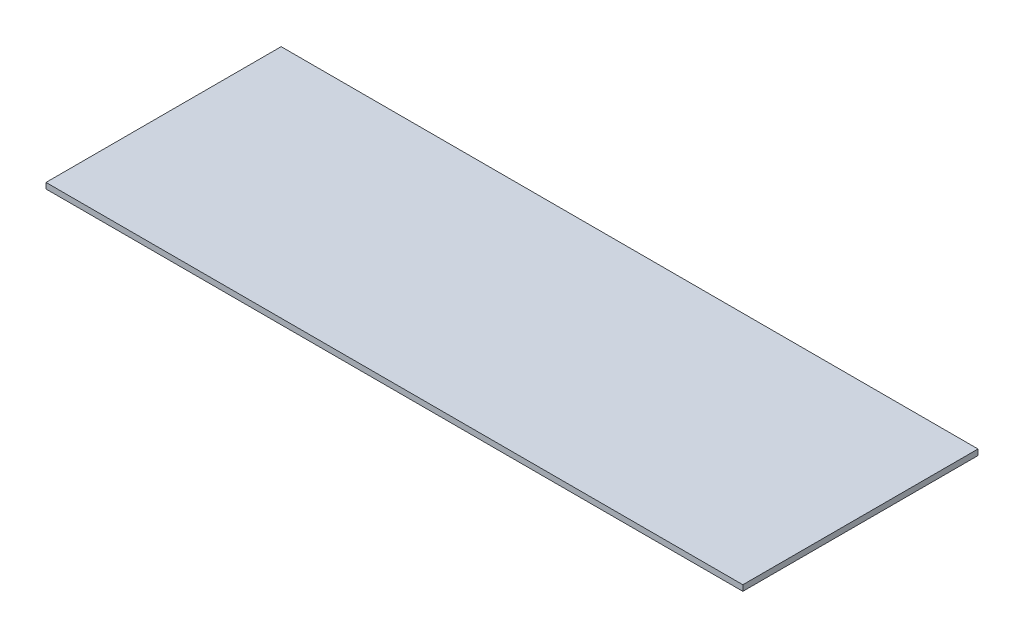
ISO-10303-21;
HEADER;
FILE_DESCRIPTION(('STEP AP214'),'2;1');
FILE_NAME('part.step','',(''),(''),'','','');
FILE_SCHEMA(('AUTOMOTIVE_DESIGN { 1 0 10303 214 1 1 1 1 }'));
ENDSEC;
DATA;
#1=APPLICATION_CONTEXT('core data for automotive mechanical design processes');
#2=APPLICATION_PROTOCOL_DEFINITION('international standard','automotive_design',2000,#1);
#3=PRODUCT_CONTEXT('',#1,'mechanical');
#4=PRODUCT('Part','Part','',(#3));
#5=PRODUCT_RELATED_PRODUCT_CATEGORY('part','',(#4));
#6=PRODUCT_DEFINITION_FORMATION('','',#4);
#7=PRODUCT_DEFINITION_CONTEXT('part definition',#1,'design');
#8=PRODUCT_DEFINITION('design','',#6,#7);
#9=PRODUCT_DEFINITION_SHAPE('','',#8);
#10=(LENGTH_UNIT() NAMED_UNIT(*) SI_UNIT(.MILLI.,.METRE.));
#11=(NAMED_UNIT(*) PLANE_ANGLE_UNIT() SI_UNIT($,.RADIAN.));
#12=(NAMED_UNIT(*) SI_UNIT($,.STERADIAN.) SOLID_ANGLE_UNIT());
#13=UNCERTAINTY_MEASURE_WITH_UNIT(LENGTH_MEASURE(1.E-05),#10,'distance_accuracy_value','');
#14=(GEOMETRIC_REPRESENTATION_CONTEXT(3) GLOBAL_UNCERTAINTY_ASSIGNED_CONTEXT((#13)) GLOBAL_UNIT_ASSIGNED_CONTEXT((#10,
#11,#12)) REPRESENTATION_CONTEXT('',''));
#15=CARTESIAN_POINT('',(0.,0.,0.));
#16=DIRECTION('',(0.,0.,1.));
#17=DIRECTION('',(1.,0.,0.));
#18=AXIS2_PLACEMENT_3D('',#15,#16,#17);
#19=CARTESIAN_POINT('',(3037.5,50.,1025.));
#20=DIRECTION('',(-1.,0.,0.));
#21=DIRECTION('',(0.,0.,1.));
#22=AXIS2_PLACEMENT_3D('',#19,#20,#21);
#23=PLANE('',#22);
#24=DIRECTION('',(0.,0.,-1.));
#25=VECTOR('',#24,1.);
#26=CARTESIAN_POINT('',(3037.5,0.,1025.));
#27=LINE('',#26,#25);
#28=CARTESIAN_POINT('',(3037.5,0.,1025.));
#29=VERTEX_POINT('',#28);
#30=CARTESIAN_POINT('',(3037.5,0.,-1025.));
#31=VERTEX_POINT('',#30);
#32=EDGE_CURVE('E102',#29,#31,#27,.T.);
#33=ORIENTED_EDGE('',*,*,#32,.T.);
#34=DIRECTION('',(0.,-1.,0.));
#35=VECTOR('',#34,1.);
#36=CARTESIAN_POINT('',(3037.5,50.,-1025.));
#37=LINE('',#36,#35);
#38=CARTESIAN_POINT('',(3037.5,50.,-1025.));
#39=VERTEX_POINT('',#38);
#40=EDGE_CURVE('E11',#39,#31,#37,.T.);
#41=ORIENTED_EDGE('',*,*,#40,.F.);
#42=DIRECTION('',(0.,0.,-1.));
#43=VECTOR('',#42,1.);
#44=CARTESIAN_POINT('',(3037.5,50.,1025.));
#45=LINE('',#44,#43);
#46=CARTESIAN_POINT('',(3037.5,50.,1025.));
#47=VERTEX_POINT('',#46);
#48=EDGE_CURVE('E95',#47,#39,#45,.T.);
#49=ORIENTED_EDGE('',*,*,#48,.F.);
#50=DIRECTION('',(0.,-1.,0.));
#51=VECTOR('',#50,1.);
#52=CARTESIAN_POINT('',(3037.5,50.,1025.));
#53=LINE('',#52,#51);
#54=EDGE_CURVE('E99',#47,#29,#53,.T.);
#55=ORIENTED_EDGE('',*,*,#54,.T.);
#56=EDGE_LOOP('',(#33,#41,#49,#55));
#57=FACE_BOUND('',#56,.T.);
#58=ADVANCED_FACE('F41',(#57),#23,.F.);
#59=CARTESIAN_POINT('',(-3037.5,50.,-1025.));
#60=DIRECTION('',(0.,0.,1.));
#61=DIRECTION('',(1.,0.,0.));
#62=AXIS2_PLACEMENT_3D('',#59,#60,#61);
#63=PLANE('',#62);
#64=DIRECTION('',(-1.,0.,0.));
#65=VECTOR('',#64,1.);
#66=CARTESIAN_POINT('',(-3037.5,0.,-1025.));
#67=LINE('',#66,#65);
#68=CARTESIAN_POINT('',(-3037.5,0.,-1025.));
#69=VERTEX_POINT('',#68);
#70=EDGE_CURVE('E96',#31,#69,#67,.T.);
#71=ORIENTED_EDGE('',*,*,#70,.T.);
#72=DIRECTION('',(0.,-1.,0.));
#73=VECTOR('',#72,1.);
#74=CARTESIAN_POINT('',(-3037.5,50.,-1025.));
#75=LINE('',#74,#73);
#76=CARTESIAN_POINT('',(-3037.5,50.,-1025.));
#77=VERTEX_POINT('',#76);
#78=EDGE_CURVE('E47',#77,#69,#75,.T.);
#79=ORIENTED_EDGE('',*,*,#78,.F.);
#80=DIRECTION('',(-1.,0.,0.));
#81=VECTOR('',#80,1.);
#82=CARTESIAN_POINT('',(-3037.5,50.,-1025.));
#83=LINE('',#82,#81);
#84=EDGE_CURVE('E87',#39,#77,#83,.T.);
#85=ORIENTED_EDGE('',*,*,#84,.F.);
#86=ORIENTED_EDGE('',*,*,#40,.T.);
#87=EDGE_LOOP('',(#71,#79,#85,#86));
#88=FACE_BOUND('',#87,.T.);
#89=ADVANCED_FACE('F92',(#88),#63,.F.);
#90=CARTESIAN_POINT('',(-3037.5,50.,1025.));
#91=DIRECTION('',(1.,0.,0.));
#92=DIRECTION('',(0.,0.,-1.));
#93=AXIS2_PLACEMENT_3D('',#90,#91,#92);
#94=PLANE('',#93);
#95=DIRECTION('',(0.,0.,1.));
#96=VECTOR('',#95,1.);
#97=CARTESIAN_POINT('',(-3037.5,0.,1025.));
#98=LINE('',#97,#96);
#99=CARTESIAN_POINT('',(-3037.5,0.,1025.));
#100=VERTEX_POINT('',#99);
#101=EDGE_CURVE('E74',#69,#100,#98,.T.);
#102=ORIENTED_EDGE('',*,*,#101,.T.);
#103=DIRECTION('',(0.,-1.,0.));
#104=VECTOR('',#103,1.);
#105=CARTESIAN_POINT('',(-3037.5,50.,1025.));
#106=LINE('',#105,#104);
#107=CARTESIAN_POINT('',(-3037.5,50.,1025.));
#108=VERTEX_POINT('',#107);
#109=EDGE_CURVE('E100',#108,#100,#106,.T.);
#110=ORIENTED_EDGE('',*,*,#109,.F.);
#111=DIRECTION('',(0.,0.,1.));
#112=VECTOR('',#111,1.);
#113=CARTESIAN_POINT('',(-3037.5,50.,1025.));
#114=LINE('',#113,#112);
#115=EDGE_CURVE('E89',#77,#108,#114,.T.);
#116=ORIENTED_EDGE('',*,*,#115,.F.);
#117=ORIENTED_EDGE('',*,*,#78,.T.);
#118=EDGE_LOOP('',(#102,#110,#116,#117));
#119=FACE_BOUND('',#118,.T.);
#120=ADVANCED_FACE('F98',(#119),#94,.F.);
#121=CARTESIAN_POINT('',(-3037.5,50.,1025.));
#122=DIRECTION('',(0.,0.,-1.));
#123=DIRECTION('',(-1.,0.,0.));
#124=AXIS2_PLACEMENT_3D('',#121,#122,#123);
#125=PLANE('',#124);
#126=DIRECTION('',(1.,0.,0.));
#127=VECTOR('',#126,1.);
#128=CARTESIAN_POINT('',(-3037.5,0.,1025.));
#129=LINE('',#128,#127);
#130=EDGE_CURVE('E76',#100,#29,#129,.T.);
#131=ORIENTED_EDGE('',*,*,#130,.T.);
#132=ORIENTED_EDGE('',*,*,#54,.F.);
#133=DIRECTION('',(1.,0.,0.));
#134=VECTOR('',#133,1.);
#135=CARTESIAN_POINT('',(-3037.5,50.,1025.));
#136=LINE('',#135,#134);
#137=EDGE_CURVE('E60',#108,#47,#136,.T.);
#138=ORIENTED_EDGE('',*,*,#137,.F.);
#139=ORIENTED_EDGE('',*,*,#109,.T.);
#140=EDGE_LOOP('',(#131,#132,#138,#139));
#141=FACE_BOUND('',#140,.T.);
#142=ADVANCED_FACE('F112',(#141),#125,.F.);
#143=CARTESIAN_POINT('',(0.,50.,0.));
#144=DIRECTION('',(0.,-1.,0.));
#145=DIRECTION('',(0.,0.,-1.));
#146=AXIS2_PLACEMENT_3D('',#143,#144,#145);
#147=PLANE('',#146);
#148=ORIENTED_EDGE('',*,*,#48,.T.);
#149=ORIENTED_EDGE('',*,*,#84,.T.);
#150=ORIENTED_EDGE('',*,*,#115,.T.);
#151=ORIENTED_EDGE('',*,*,#137,.T.);
#152=EDGE_LOOP('',(#148,#149,#150,#151));
#153=FACE_BOUND('',#152,.T.);
#154=ADVANCED_FACE('F86',(#153),#147,.F.);
#155=CARTESIAN_POINT('',(0.,0.,0.));
#156=DIRECTION('',(0.,-1.,0.));
#157=DIRECTION('',(0.,0.,-1.));
#158=AXIS2_PLACEMENT_3D('',#155,#156,#157);
#159=PLANE('',#158);
#160=ORIENTED_EDGE('',*,*,#32,.F.);
#161=ORIENTED_EDGE('',*,*,#130,.F.);
#162=ORIENTED_EDGE('',*,*,#101,.F.);
#163=ORIENTED_EDGE('',*,*,#70,.F.);
#164=EDGE_LOOP('',(#160,#161,#162,#163));
#165=FACE_BOUND('',#164,.T.);
#166=ADVANCED_FACE('F111',(#165),#159,.T.);
#167=CLOSED_SHELL('',(#58,#89,#120,#142,#154,#166));
#168=MANIFOLD_SOLID_BREP('B2',#167);
#169=ADVANCED_BREP_SHAPE_REPRESENTATION('',(#18,#168),#14);
#170=SHAPE_DEFINITION_REPRESENTATION(#9,#169);
ENDSEC;
END-ISO-10303-21;
